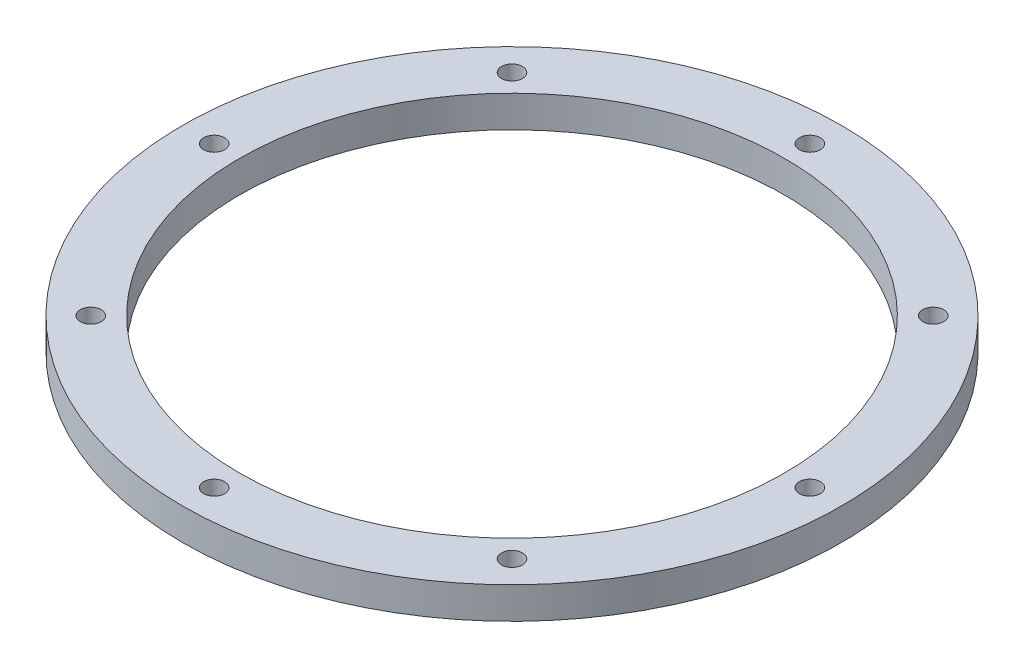
ISO-10303-21;
HEADER;
FILE_DESCRIPTION(('STEP AP214'),'2;1');
FILE_NAME('part.step','',(''),(''),'','','');
FILE_SCHEMA(('AUTOMOTIVE_DESIGN { 1 0 10303 214 1 1 1 1 }'));
ENDSEC;
DATA;
#1=APPLICATION_CONTEXT('core data for automotive mechanical design processes');
#2=APPLICATION_PROTOCOL_DEFINITION('international standard','automotive_design',2000,#1);
#3=PRODUCT_CONTEXT('',#1,'mechanical');
#4=PRODUCT('Part','Part','',(#3));
#5=PRODUCT_RELATED_PRODUCT_CATEGORY('part','',(#4));
#6=PRODUCT_DEFINITION_FORMATION('','',#4);
#7=PRODUCT_DEFINITION_CONTEXT('part definition',#1,'design');
#8=PRODUCT_DEFINITION('design','',#6,#7);
#9=PRODUCT_DEFINITION_SHAPE('','',#8);
#10=(LENGTH_UNIT() NAMED_UNIT(*) SI_UNIT(.MILLI.,.METRE.));
#11=(NAMED_UNIT(*) PLANE_ANGLE_UNIT() SI_UNIT($,.RADIAN.));
#12=(NAMED_UNIT(*) SI_UNIT($,.STERADIAN.) SOLID_ANGLE_UNIT());
#13=UNCERTAINTY_MEASURE_WITH_UNIT(LENGTH_MEASURE(1.E-05),#10,'distance_accuracy_value','');
#14=(GEOMETRIC_REPRESENTATION_CONTEXT(3) GLOBAL_UNCERTAINTY_ASSIGNED_CONTEXT((#13)) GLOBAL_UNIT_ASSIGNED_CONTEXT((#10,
#11,#12)) REPRESENTATION_CONTEXT('',''));
#15=CARTESIAN_POINT('',(0.,0.,0.));
#16=DIRECTION('',(0.,0.,1.));
#17=DIRECTION('',(1.,0.,0.));
#18=AXIS2_PLACEMENT_3D('',#15,#16,#17);
#19=CARTESIAN_POINT('',(0.,5.,0.));
#20=DIRECTION('',(0.,1.,0.));
#21=DIRECTION('',(0.,0.,1.));
#22=AXIS2_PLACEMENT_3D('',#19,#20,#21);
#23=PLANE('',#22);
#24=CARTESIAN_POINT('',(0.,5.,-47.));
#25=DIRECTION('',(0.,1.,0.));
#26=DIRECTION('',(0.,0.,1.));
#27=AXIS2_PLACEMENT_3D('',#24,#25,#26);
#28=CIRCLE('',#27,1.65);
#29=CARTESIAN_POINT('',(0.,5.,-45.35));
#30=VERTEX_POINT('',#29);
#31=EDGE_CURVE('E86',#30,#30,#28,.T.);
#32=ORIENTED_EDGE('',*,*,#31,.F.);
#33=EDGE_LOOP('',(#32));
#34=FACE_BOUND('',#33,.T.);
#35=CARTESIAN_POINT('',(-47.,5.,0.));
#36=DIRECTION('',(0.,1.,0.));
#37=DIRECTION('',(0.,0.,1.));
#38=AXIS2_PLACEMENT_3D('',#35,#36,#37);
#39=CIRCLE('',#38,1.65);
#40=CARTESIAN_POINT('',(-47.,5.,1.65));
#41=VERTEX_POINT('',#40);
#42=EDGE_CURVE('E74',#41,#41,#39,.T.);
#43=ORIENTED_EDGE('',*,*,#42,.F.);
#44=EDGE_LOOP('',(#43));
#45=FACE_BOUND('',#44,.T.);
#46=CARTESIAN_POINT('',(0.,5.,47.));
#47=DIRECTION('',(0.,1.,0.));
#48=DIRECTION('',(0.,0.,1.));
#49=AXIS2_PLACEMENT_3D('',#46,#47,#48);
#50=CIRCLE('',#49,1.65);
#51=CARTESIAN_POINT('',(0.,5.,48.65));
#52=VERTEX_POINT('',#51);
#53=EDGE_CURVE('E62',#52,#52,#50,.T.);
#54=ORIENTED_EDGE('',*,*,#53,.F.);
#55=EDGE_LOOP('',(#54));
#56=FACE_BOUND('',#55,.T.);
#57=CARTESIAN_POINT('',(47.,5.,0.));
#58=DIRECTION('',(0.,1.,0.));
#59=DIRECTION('',(0.,0.,1.));
#60=AXIS2_PLACEMENT_3D('',#57,#58,#59);
#61=CIRCLE('',#60,1.65);
#62=CARTESIAN_POINT('',(47.,5.,1.65));
#63=VERTEX_POINT('',#62);
#64=EDGE_CURVE('E50',#63,#63,#61,.T.);
#65=ORIENTED_EDGE('',*,*,#64,.F.);
#66=EDGE_LOOP('',(#65));
#67=FACE_BOUND('',#66,.T.);
#68=CARTESIAN_POINT('',(0.,5.,0.));
#69=DIRECTION('',(0.,1.,0.));
#70=DIRECTION('',(0.,0.,1.));
#71=AXIS2_PLACEMENT_3D('',#68,#69,#70);
#72=CIRCLE('',#71,52.);
#73=CARTESIAN_POINT('',(0.,5.,52.));
#74=VERTEX_POINT('',#73);
#75=EDGE_CURVE('E10',#74,#74,#72,.T.);
#76=ORIENTED_EDGE('',*,*,#75,.T.);
#77=EDGE_LOOP('',(#76));
#78=FACE_BOUND('',#77,.T.);
#79=CARTESIAN_POINT('',(0.,5.,0.));
#80=DIRECTION('',(0.,1.,0.));
#81=DIRECTION('',(0.,0.,1.));
#82=AXIS2_PLACEMENT_3D('',#79,#80,#81);
#83=CIRCLE('',#82,43.);
#84=CARTESIAN_POINT('',(0.,5.,43.));
#85=VERTEX_POINT('',#84);
#86=EDGE_CURVE('E45',#85,#85,#83,.T.);
#87=ORIENTED_EDGE('',*,*,#86,.F.);
#88=EDGE_LOOP('',(#87));
#89=FACE_BOUND('',#88,.T.);
#90=CARTESIAN_POINT('',(33.2340187157677,5.,33.2340187157677));
#91=DIRECTION('',(0.,1.,0.));
#92=DIRECTION('',(0.,0.,1.));
#93=AXIS2_PLACEMENT_3D('',#90,#91,#92);
#94=CIRCLE('',#93,1.65);
#95=CARTESIAN_POINT('',(33.2340187157677,5.,34.8840187157677));
#96=VERTEX_POINT('',#95);
#97=EDGE_CURVE('E56',#96,#96,#94,.T.);
#98=ORIENTED_EDGE('',*,*,#97,.F.);
#99=EDGE_LOOP('',(#98));
#100=FACE_BOUND('',#99,.T.);
#101=CARTESIAN_POINT('',(-33.2340187157677,5.,33.2340187157677));
#102=DIRECTION('',(0.,1.,0.));
#103=DIRECTION('',(0.,0.,1.));
#104=AXIS2_PLACEMENT_3D('',#101,#102,#103);
#105=CIRCLE('',#104,1.65);
#106=CARTESIAN_POINT('',(-33.2340187157677,5.,34.8840187157677));
#107=VERTEX_POINT('',#106);
#108=EDGE_CURVE('E68',#107,#107,#105,.T.);
#109=ORIENTED_EDGE('',*,*,#108,.F.);
#110=EDGE_LOOP('',(#109));
#111=FACE_BOUND('',#110,.T.);
#112=CARTESIAN_POINT('',(-33.2340187157677,5.,-33.2340187157677));
#113=DIRECTION('',(0.,1.,0.));
#114=DIRECTION('',(0.,0.,1.));
#115=AXIS2_PLACEMENT_3D('',#112,#113,#114);
#116=CIRCLE('',#115,1.65);
#117=CARTESIAN_POINT('',(-33.2340187157677,5.,-31.5840187157677));
#118=VERTEX_POINT('',#117);
#119=EDGE_CURVE('E80',#118,#118,#116,.T.);
#120=ORIENTED_EDGE('',*,*,#119,.F.);
#121=EDGE_LOOP('',(#120));
#122=FACE_BOUND('',#121,.T.);
#123=CARTESIAN_POINT('',(33.2340187157677,5.,-33.2340187157677));
#124=DIRECTION('',(0.,1.,0.));
#125=DIRECTION('',(0.,0.,1.));
#126=AXIS2_PLACEMENT_3D('',#123,#124,#125);
#127=CIRCLE('',#126,1.65);
#128=CARTESIAN_POINT('',(33.2340187157677,5.,-31.5840187157677));
#129=VERTEX_POINT('',#128);
#130=EDGE_CURVE('E92',#129,#129,#127,.T.);
#131=ORIENTED_EDGE('',*,*,#130,.F.);
#132=EDGE_LOOP('',(#131));
#133=FACE_BOUND('',#132,.T.);
#134=ADVANCED_FACE('F34',(#34,#45,#56,#67,#78,#89,#100,#111,#122,#133),#23,.T.);
#135=CARTESIAN_POINT('',(0.,0.,0.));
#136=DIRECTION('',(0.,1.,0.));
#137=DIRECTION('',(0.,0.,1.));
#138=AXIS2_PLACEMENT_3D('',#135,#136,#137);
#139=PLANE('',#138);
#140=CARTESIAN_POINT('',(0.,0.,0.));
#141=DIRECTION('',(0.,1.,0.));
#142=DIRECTION('',(0.,0.,1.));
#143=AXIS2_PLACEMENT_3D('',#140,#141,#142);
#144=CIRCLE('',#143,52.);
#145=CARTESIAN_POINT('',(0.,0.,52.));
#146=VERTEX_POINT('',#145);
#147=EDGE_CURVE('E38',#146,#146,#144,.T.);
#148=ORIENTED_EDGE('',*,*,#147,.F.);
#149=EDGE_LOOP('',(#148));
#150=FACE_BOUND('',#149,.T.);
#151=CARTESIAN_POINT('',(0.,0.,0.));
#152=DIRECTION('',(0.,1.,0.));
#153=DIRECTION('',(0.,0.,1.));
#154=AXIS2_PLACEMENT_3D('',#151,#152,#153);
#155=CIRCLE('',#154,43.);
#156=CARTESIAN_POINT('',(0.,0.,43.));
#157=VERTEX_POINT('',#156);
#158=EDGE_CURVE('E47',#157,#157,#155,.T.);
#159=ORIENTED_EDGE('',*,*,#158,.T.);
#160=EDGE_LOOP('',(#159));
#161=FACE_BOUND('',#160,.T.);
#162=CARTESIAN_POINT('',(47.,0.,0.));
#163=DIRECTION('',(0.,1.,0.));
#164=DIRECTION('',(0.,0.,1.));
#165=AXIS2_PLACEMENT_3D('',#162,#163,#164);
#166=CIRCLE('',#165,1.65);
#167=CARTESIAN_POINT('',(47.,0.,1.65));
#168=VERTEX_POINT('',#167);
#169=EDGE_CURVE('E53',#168,#168,#166,.T.);
#170=ORIENTED_EDGE('',*,*,#169,.T.);
#171=EDGE_LOOP('',(#170));
#172=FACE_BOUND('',#171,.T.);
#173=CARTESIAN_POINT('',(33.2340187157677,0.,33.2340187157677));
#174=DIRECTION('',(0.,1.,0.));
#175=DIRECTION('',(0.,0.,1.));
#176=AXIS2_PLACEMENT_3D('',#173,#174,#175);
#177=CIRCLE('',#176,1.65);
#178=CARTESIAN_POINT('',(33.2340187157677,0.,34.8840187157677));
#179=VERTEX_POINT('',#178);
#180=EDGE_CURVE('E59',#179,#179,#177,.T.);
#181=ORIENTED_EDGE('',*,*,#180,.T.);
#182=EDGE_LOOP('',(#181));
#183=FACE_BOUND('',#182,.T.);
#184=CARTESIAN_POINT('',(0.,0.,47.));
#185=DIRECTION('',(0.,1.,0.));
#186=DIRECTION('',(0.,0.,1.));
#187=AXIS2_PLACEMENT_3D('',#184,#185,#186);
#188=CIRCLE('',#187,1.65);
#189=CARTESIAN_POINT('',(0.,0.,48.65));
#190=VERTEX_POINT('',#189);
#191=EDGE_CURVE('E65',#190,#190,#188,.T.);
#192=ORIENTED_EDGE('',*,*,#191,.T.);
#193=EDGE_LOOP('',(#192));
#194=FACE_BOUND('',#193,.T.);
#195=CARTESIAN_POINT('',(-33.2340187157677,0.,33.2340187157677));
#196=DIRECTION('',(0.,1.,0.));
#197=DIRECTION('',(0.,0.,1.));
#198=AXIS2_PLACEMENT_3D('',#195,#196,#197);
#199=CIRCLE('',#198,1.65);
#200=CARTESIAN_POINT('',(-33.2340187157677,0.,34.8840187157677));
#201=VERTEX_POINT('',#200);
#202=EDGE_CURVE('E71',#201,#201,#199,.T.);
#203=ORIENTED_EDGE('',*,*,#202,.T.);
#204=EDGE_LOOP('',(#203));
#205=FACE_BOUND('',#204,.T.);
#206=CARTESIAN_POINT('',(-47.,0.,0.));
#207=DIRECTION('',(0.,1.,0.));
#208=DIRECTION('',(0.,0.,1.));
#209=AXIS2_PLACEMENT_3D('',#206,#207,#208);
#210=CIRCLE('',#209,1.65);
#211=CARTESIAN_POINT('',(-47.,0.,1.65));
#212=VERTEX_POINT('',#211);
#213=EDGE_CURVE('E77',#212,#212,#210,.T.);
#214=ORIENTED_EDGE('',*,*,#213,.T.);
#215=EDGE_LOOP('',(#214));
#216=FACE_BOUND('',#215,.T.);
#217=CARTESIAN_POINT('',(-33.2340187157677,0.,-33.2340187157677));
#218=DIRECTION('',(0.,1.,0.));
#219=DIRECTION('',(0.,0.,1.));
#220=AXIS2_PLACEMENT_3D('',#217,#218,#219);
#221=CIRCLE('',#220,1.65);
#222=CARTESIAN_POINT('',(-33.2340187157677,0.,-31.5840187157677));
#223=VERTEX_POINT('',#222);
#224=EDGE_CURVE('E83',#223,#223,#221,.T.);
#225=ORIENTED_EDGE('',*,*,#224,.T.);
#226=EDGE_LOOP('',(#225));
#227=FACE_BOUND('',#226,.T.);
#228=CARTESIAN_POINT('',(0.,0.,-47.));
#229=DIRECTION('',(0.,1.,0.));
#230=DIRECTION('',(0.,0.,1.));
#231=AXIS2_PLACEMENT_3D('',#228,#229,#230);
#232=CIRCLE('',#231,1.65);
#233=CARTESIAN_POINT('',(0.,0.,-45.35));
#234=VERTEX_POINT('',#233);
#235=EDGE_CURVE('E89',#234,#234,#232,.T.);
#236=ORIENTED_EDGE('',*,*,#235,.T.);
#237=EDGE_LOOP('',(#236));
#238=FACE_BOUND('',#237,.T.);
#239=CARTESIAN_POINT('',(33.2340187157677,0.,-33.2340187157677));
#240=DIRECTION('',(0.,1.,0.));
#241=DIRECTION('',(0.,0.,1.));
#242=AXIS2_PLACEMENT_3D('',#239,#240,#241);
#243=CIRCLE('',#242,1.65);
#244=CARTESIAN_POINT('',(33.2340187157677,0.,-31.5840187157677));
#245=VERTEX_POINT('',#244);
#246=EDGE_CURVE('E95',#245,#245,#243,.T.);
#247=ORIENTED_EDGE('',*,*,#246,.T.);
#248=EDGE_LOOP('',(#247));
#249=FACE_BOUND('',#248,.T.);
#250=ADVANCED_FACE('F105',(#150,#161,#172,#183,#194,#205,#216,#227,#238,#249),#139,.F.);
#251=CARTESIAN_POINT('',(0.,5.,0.));
#252=DIRECTION('',(0.,-1.,0.));
#253=DIRECTION('',(0.,0.,-1.));
#254=AXIS2_PLACEMENT_3D('',#251,#252,#253);
#255=CYLINDRICAL_SURFACE('',#254,52.);
#256=ORIENTED_EDGE('',*,*,#75,.F.);
#257=EDGE_LOOP('',(#256));
#258=FACE_BOUND('',#257,.T.);
#259=ORIENTED_EDGE('',*,*,#147,.T.);
#260=EDGE_LOOP('',(#259));
#261=FACE_BOUND('',#260,.T.);
#262=ADVANCED_FACE('F36',(#258,#261),#255,.T.);
#263=CARTESIAN_POINT('',(0.,5.,0.));
#264=DIRECTION('',(0.,-1.,0.));
#265=DIRECTION('',(0.,0.,-1.));
#266=AXIS2_PLACEMENT_3D('',#263,#264,#265);
#267=CYLINDRICAL_SURFACE('',#266,43.);
#268=ORIENTED_EDGE('',*,*,#86,.T.);
#269=EDGE_LOOP('',(#268));
#270=FACE_BOUND('',#269,.T.);
#271=ORIENTED_EDGE('',*,*,#158,.F.);
#272=EDGE_LOOP('',(#271));
#273=FACE_BOUND('',#272,.T.);
#274=ADVANCED_FACE('F115',(#270,#273),#267,.F.);
#275=CARTESIAN_POINT('',(47.,5.,0.));
#276=DIRECTION('',(0.,-1.,0.));
#277=DIRECTION('',(0.,0.,-1.));
#278=AXIS2_PLACEMENT_3D('',#275,#276,#277);
#279=CYLINDRICAL_SURFACE('',#278,1.65);
#280=ORIENTED_EDGE('',*,*,#64,.T.);
#281=EDGE_LOOP('',(#280));
#282=FACE_BOUND('',#281,.T.);
#283=ORIENTED_EDGE('',*,*,#169,.F.);
#284=EDGE_LOOP('',(#283));
#285=FACE_BOUND('',#284,.T.);
#286=ADVANCED_FACE('F118',(#282,#285),#279,.F.);
#287=CARTESIAN_POINT('',(33.2340187157677,5.,33.2340187157677));
#288=DIRECTION('',(0.,-1.,0.));
#289=DIRECTION('',(0.,0.,-1.));
#290=AXIS2_PLACEMENT_3D('',#287,#288,#289);
#291=CYLINDRICAL_SURFACE('',#290,1.65);
#292=ORIENTED_EDGE('',*,*,#97,.T.);
#293=EDGE_LOOP('',(#292));
#294=FACE_BOUND('',#293,.T.);
#295=ORIENTED_EDGE('',*,*,#180,.F.);
#296=EDGE_LOOP('',(#295));
#297=FACE_BOUND('',#296,.T.);
#298=ADVANCED_FACE('F122',(#294,#297),#291,.F.);
#299=CARTESIAN_POINT('',(0.,5.,47.));
#300=DIRECTION('',(0.,-1.,0.));
#301=DIRECTION('',(0.,0.,-1.));
#302=AXIS2_PLACEMENT_3D('',#299,#300,#301);
#303=CYLINDRICAL_SURFACE('',#302,1.65);
#304=ORIENTED_EDGE('',*,*,#53,.T.);
#305=EDGE_LOOP('',(#304));
#306=FACE_BOUND('',#305,.T.);
#307=ORIENTED_EDGE('',*,*,#191,.F.);
#308=EDGE_LOOP('',(#307));
#309=FACE_BOUND('',#308,.T.);
#310=ADVANCED_FACE('F126',(#306,#309),#303,.F.);
#311=CARTESIAN_POINT('',(-33.2340187157677,5.,33.2340187157677));
#312=DIRECTION('',(0.,-1.,0.));
#313=DIRECTION('',(0.,0.,-1.));
#314=AXIS2_PLACEMENT_3D('',#311,#312,#313);
#315=CYLINDRICAL_SURFACE('',#314,1.65);
#316=ORIENTED_EDGE('',*,*,#108,.T.);
#317=EDGE_LOOP('',(#316));
#318=FACE_BOUND('',#317,.T.);
#319=ORIENTED_EDGE('',*,*,#202,.F.);
#320=EDGE_LOOP('',(#319));
#321=FACE_BOUND('',#320,.T.);
#322=ADVANCED_FACE('F130',(#318,#321),#315,.F.);
#323=CARTESIAN_POINT('',(-47.,5.,0.));
#324=DIRECTION('',(0.,-1.,0.));
#325=DIRECTION('',(0.,0.,-1.));
#326=AXIS2_PLACEMENT_3D('',#323,#324,#325);
#327=CYLINDRICAL_SURFACE('',#326,1.65);
#328=ORIENTED_EDGE('',*,*,#42,.T.);
#329=EDGE_LOOP('',(#328));
#330=FACE_BOUND('',#329,.T.);
#331=ORIENTED_EDGE('',*,*,#213,.F.);
#332=EDGE_LOOP('',(#331));
#333=FACE_BOUND('',#332,.T.);
#334=ADVANCED_FACE('F134',(#330,#333),#327,.F.);
#335=CARTESIAN_POINT('',(-33.2340187157677,5.,-33.2340187157677));
#336=DIRECTION('',(0.,-1.,0.));
#337=DIRECTION('',(0.,0.,-1.));
#338=AXIS2_PLACEMENT_3D('',#335,#336,#337);
#339=CYLINDRICAL_SURFACE('',#338,1.65);
#340=ORIENTED_EDGE('',*,*,#119,.T.);
#341=EDGE_LOOP('',(#340));
#342=FACE_BOUND('',#341,.T.);
#343=ORIENTED_EDGE('',*,*,#224,.F.);
#344=EDGE_LOOP('',(#343));
#345=FACE_BOUND('',#344,.T.);
#346=ADVANCED_FACE('F138',(#342,#345),#339,.F.);
#347=CARTESIAN_POINT('',(0.,5.,-47.));
#348=DIRECTION('',(0.,-1.,0.));
#349=DIRECTION('',(0.,0.,-1.));
#350=AXIS2_PLACEMENT_3D('',#347,#348,#349);
#351=CYLINDRICAL_SURFACE('',#350,1.65);
#352=ORIENTED_EDGE('',*,*,#31,.T.);
#353=EDGE_LOOP('',(#352));
#354=FACE_BOUND('',#353,.T.);
#355=ORIENTED_EDGE('',*,*,#235,.F.);
#356=EDGE_LOOP('',(#355));
#357=FACE_BOUND('',#356,.T.);
#358=ADVANCED_FACE('F142',(#354,#357),#351,.F.);
#359=CARTESIAN_POINT('',(33.2340187157677,5.,-33.2340187157677));
#360=DIRECTION('',(0.,-1.,0.));
#361=DIRECTION('',(0.,0.,-1.));
#362=AXIS2_PLACEMENT_3D('',#359,#360,#361);
#363=CYLINDRICAL_SURFACE('',#362,1.65);
#364=ORIENTED_EDGE('',*,*,#130,.T.);
#365=EDGE_LOOP('',(#364));
#366=FACE_BOUND('',#365,.T.);
#367=ORIENTED_EDGE('',*,*,#246,.F.);
#368=EDGE_LOOP('',(#367));
#369=FACE_BOUND('',#368,.T.);
#370=ADVANCED_FACE('F101',(#366,#369),#363,.F.);
#371=CLOSED_SHELL('',(#134,#250,#262,#274,#286,#298,#310,#322,#334,#346,#358,#370));
#372=MANIFOLD_SOLID_BREP('B2',#371);
#373=ADVANCED_BREP_SHAPE_REPRESENTATION('',(#18,#372),#14);
#374=SHAPE_DEFINITION_REPRESENTATION(#9,#373);
ENDSEC;
END-ISO-10303-21;
